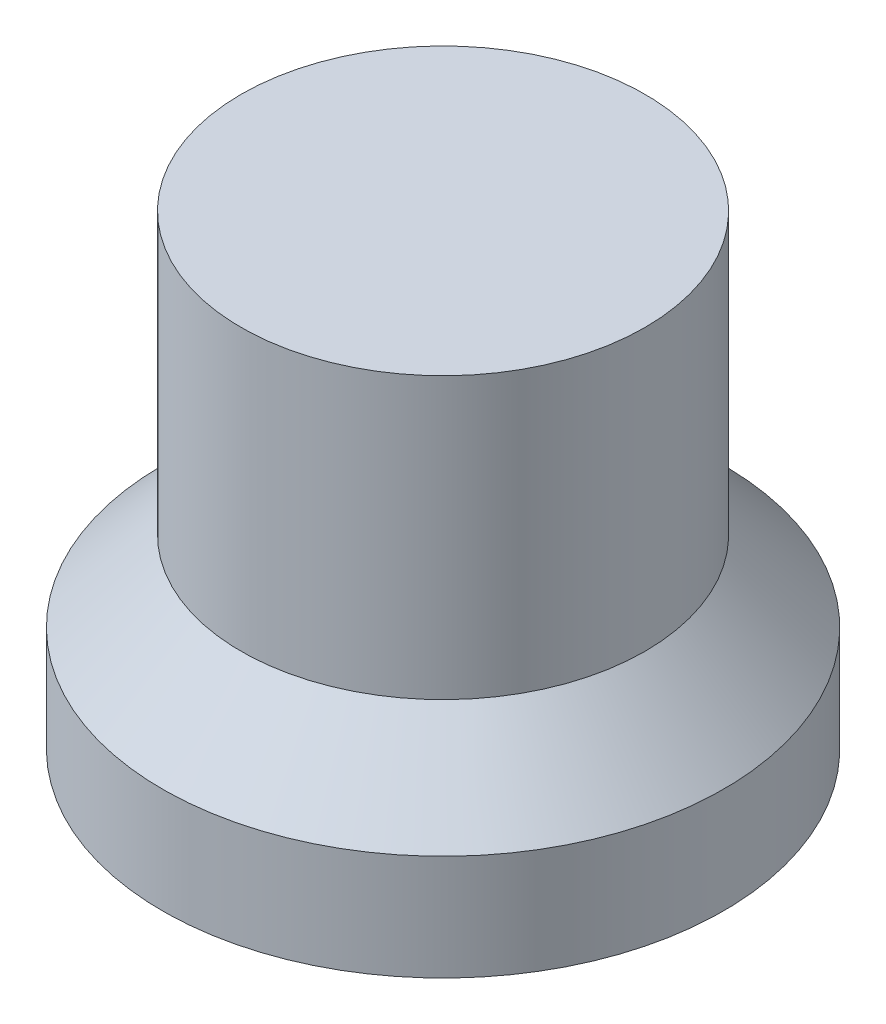
ISO-10303-21;
HEADER;
FILE_DESCRIPTION(('STEP AP214'),'2;1');
FILE_NAME('part.step','',(''),(''),'','','');
FILE_SCHEMA(('AUTOMOTIVE_DESIGN { 1 0 10303 214 1 1 1 1 }'));
ENDSEC;
DATA;
#1=APPLICATION_CONTEXT('core data for automotive mechanical design processes');
#2=APPLICATION_PROTOCOL_DEFINITION('international standard','automotive_design',2000,#1);
#3=PRODUCT_CONTEXT('',#1,'mechanical');
#4=PRODUCT('Part','Part','',(#3));
#5=PRODUCT_RELATED_PRODUCT_CATEGORY('part','',(#4));
#6=PRODUCT_DEFINITION_FORMATION('','',#4);
#7=PRODUCT_DEFINITION_CONTEXT('part definition',#1,'design');
#8=PRODUCT_DEFINITION('design','',#6,#7);
#9=PRODUCT_DEFINITION_SHAPE('','',#8);
#10=(LENGTH_UNIT() NAMED_UNIT(*) SI_UNIT(.MILLI.,.METRE.));
#11=(NAMED_UNIT(*) PLANE_ANGLE_UNIT() SI_UNIT($,.RADIAN.));
#12=(NAMED_UNIT(*) SI_UNIT($,.STERADIAN.) SOLID_ANGLE_UNIT());
#13=UNCERTAINTY_MEASURE_WITH_UNIT(LENGTH_MEASURE(1.E-05),#10,'distance_accuracy_value','');
#14=(GEOMETRIC_REPRESENTATION_CONTEXT(3) GLOBAL_UNCERTAINTY_ASSIGNED_CONTEXT((#13)) GLOBAL_UNIT_ASSIGNED_CONTEXT((#10,
#11,#12)) REPRESENTATION_CONTEXT('',''));
#15=CARTESIAN_POINT('',(0.,0.,0.));
#16=DIRECTION('',(0.,0.,1.));
#17=DIRECTION('',(1.,0.,0.));
#18=AXIS2_PLACEMENT_3D('',#15,#16,#17);
#19=CARTESIAN_POINT('',(0.,0.,0.));
#20=DIRECTION('',(0.,1.,0.));
#21=DIRECTION('',(-1.,0.,0.));
#22=AXIS2_PLACEMENT_3D('',#19,#20,#21);
#23=PLANE('',#22);
#24=CARTESIAN_POINT('',(0.,0.,0.));
#25=DIRECTION('',(0.,1.,0.));
#26=DIRECTION('',(-1.,0.,0.));
#27=AXIS2_PLACEMENT_3D('',#24,#25,#26);
#28=CIRCLE('',#27,9.);
#29=CARTESIAN_POINT('',(-9.,0.,0.));
#30=VERTEX_POINT('',#29);
#31=EDGE_CURVE('E10',#30,#30,#28,.T.);
#32=ORIENTED_EDGE('',*,*,#31,.T.);
#33=EDGE_LOOP('',(#32));
#34=FACE_BOUND('',#33,.T.);
#35=ADVANCED_FACE('F31',(#34),#23,.T.);
#36=CARTESIAN_POINT('',(0.,0.,0.));
#37=DIRECTION('',(0.,1.,0.));
#38=DIRECTION('',(-1.,0.,0.));
#39=AXIS2_PLACEMENT_3D('',#36,#37,#38);
#40=CYLINDRICAL_SURFACE('',#39,9.);
#41=CARTESIAN_POINT('',(0.,-12.5,0.));
#42=DIRECTION('',(0.,1.,0.));
#43=DIRECTION('',(-1.,0.,0.));
#44=AXIS2_PLACEMENT_3D('',#41,#42,#43);
#45=CIRCLE('',#44,9.);
#46=CARTESIAN_POINT('',(-9.,-12.5,0.));
#47=VERTEX_POINT('',#46);
#48=EDGE_CURVE('E37',#47,#47,#45,.T.);
#49=ORIENTED_EDGE('',*,*,#48,.T.);
#50=EDGE_LOOP('',(#49));
#51=FACE_BOUND('',#50,.T.);
#52=ORIENTED_EDGE('',*,*,#31,.F.);
#53=EDGE_LOOP('',(#52));
#54=FACE_BOUND('',#53,.T.);
#55=ADVANCED_FACE('F63',(#51,#54),#40,.T.);
#56=CARTESIAN_POINT('',(0.,-12.5,0.));
#57=DIRECTION('',(0.,-1.,0.));
#58=DIRECTION('',(1.,0.,0.));
#59=AXIS2_PLACEMENT_3D('',#56,#57,#58);
#60=CONICAL_SURFACE('',#59,9.,0.775397496610753);
#61=CARTESIAN_POINT('',(0.,-16.0707142142714,0.));
#62=DIRECTION('',(0.,1.,0.));
#63=DIRECTION('',(-1.,0.,0.));
#64=AXIS2_PLACEMENT_3D('',#61,#62,#63);
#65=CIRCLE('',#64,12.5);
#66=CARTESIAN_POINT('',(-12.5,-16.0707142142714,0.));
#67=VERTEX_POINT('',#66);
#68=EDGE_CURVE('E41',#67,#67,#65,.T.);
#69=ORIENTED_EDGE('',*,*,#68,.T.);
#70=EDGE_LOOP('',(#69));
#71=FACE_BOUND('',#70,.T.);
#72=ORIENTED_EDGE('',*,*,#48,.F.);
#73=EDGE_LOOP('',(#72));
#74=FACE_BOUND('',#73,.T.);
#75=ADVANCED_FACE('F60',(#71,#74),#60,.T.);
#76=CARTESIAN_POINT('',(0.,0.,0.));
#77=DIRECTION('',(0.,1.,0.));
#78=DIRECTION('',(-1.,0.,0.));
#79=AXIS2_PLACEMENT_3D('',#76,#77,#78);
#80=CYLINDRICAL_SURFACE('',#79,12.5);
#81=CARTESIAN_POINT('',(0.,-20.7707142142714,0.));
#82=DIRECTION('',(0.,1.,0.));
#83=DIRECTION('',(-1.,0.,0.));
#84=AXIS2_PLACEMENT_3D('',#81,#82,#83);
#85=CIRCLE('',#84,12.5);
#86=CARTESIAN_POINT('',(-12.5,-20.7707142142714,0.));
#87=VERTEX_POINT('',#86);
#88=EDGE_CURVE('E45',#87,#87,#85,.T.);
#89=ORIENTED_EDGE('',*,*,#88,.T.);
#90=EDGE_LOOP('',(#89));
#91=FACE_BOUND('',#90,.T.);
#92=ORIENTED_EDGE('',*,*,#68,.F.);
#93=EDGE_LOOP('',(#92));
#94=FACE_BOUND('',#93,.T.);
#95=ADVANCED_FACE('F51',(#91,#94),#80,.T.);
#96=CARTESIAN_POINT('',(-12.5,-20.7707142142714,0.));
#97=DIRECTION('',(0.,-1.,0.));
#98=DIRECTION('',(1.,0.,0.));
#99=AXIS2_PLACEMENT_3D('',#96,#97,#98);
#100=PLANE('',#99);
#101=ORIENTED_EDGE('',*,*,#88,.F.);
#102=EDGE_LOOP('',(#101));
#103=FACE_BOUND('',#102,.T.);
#104=ADVANCED_FACE('F54',(#103),#100,.T.);
#105=CLOSED_SHELL('',(#35,#55,#75,#95,#104));
#106=MANIFOLD_SOLID_BREP('B2',#105);
#107=ADVANCED_BREP_SHAPE_REPRESENTATION('',(#18,#106),#14);
#108=SHAPE_DEFINITION_REPRESENTATION(#9,#107);
ENDSEC;
END-ISO-10303-21;
